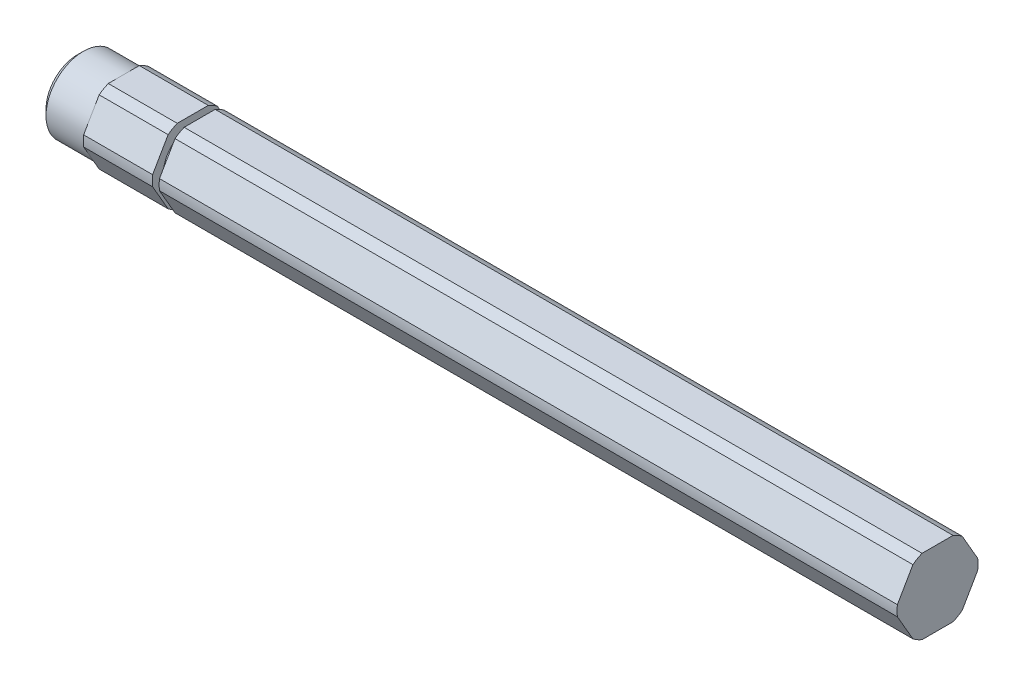
ISO-10303-21;
HEADER;
FILE_DESCRIPTION(('STEP AP214'),'2;1');
FILE_NAME('part.step','',(''),(''),'','','');
FILE_SCHEMA(('AUTOMOTIVE_DESIGN { 1 0 10303 214 1 1 1 1 }'));
ENDSEC;
DATA;
#1=APPLICATION_CONTEXT('core data for automotive mechanical design processes');
#2=APPLICATION_PROTOCOL_DEFINITION('international standard','automotive_design',2000,#1);
#3=PRODUCT_CONTEXT('',#1,'mechanical');
#4=PRODUCT('Part','Part','',(#3));
#5=PRODUCT_RELATED_PRODUCT_CATEGORY('part','',(#4));
#6=PRODUCT_DEFINITION_FORMATION('','',#4);
#7=PRODUCT_DEFINITION_CONTEXT('part definition',#1,'design');
#8=PRODUCT_DEFINITION('design','',#6,#7);
#9=PRODUCT_DEFINITION_SHAPE('','',#8);
#10=(LENGTH_UNIT() NAMED_UNIT(*) SI_UNIT(.MILLI.,.METRE.));
#11=(NAMED_UNIT(*) PLANE_ANGLE_UNIT() SI_UNIT($,.RADIAN.));
#12=(NAMED_UNIT(*) SI_UNIT($,.STERADIAN.) SOLID_ANGLE_UNIT());
#13=UNCERTAINTY_MEASURE_WITH_UNIT(LENGTH_MEASURE(1.E-05),#10,'distance_accuracy_value','');
#14=(GEOMETRIC_REPRESENTATION_CONTEXT(3) GLOBAL_UNCERTAINTY_ASSIGNED_CONTEXT((#13)) GLOBAL_UNIT_ASSIGNED_CONTEXT((#10,
#11,#12)) REPRESENTATION_CONTEXT('',''));
#15=CARTESIAN_POINT('',(0.,0.,0.));
#16=DIRECTION('',(0.,0.,1.));
#17=DIRECTION('',(1.,0.,0.));
#18=AXIS2_PLACEMENT_3D('',#15,#16,#17);
#19=CARTESIAN_POINT('',(73.025,0.,0.));
#20=DIRECTION('',(-1.,0.,0.));
#21=DIRECTION('',(0.,0.,1.));
#22=AXIS2_PLACEMENT_3D('',#19,#20,#21);
#23=CYLINDRICAL_SURFACE('',#22,6.875);
#24=DIRECTION('',(-1.,0.,0.));
#25=VECTOR('',#24,1.);
#26=CARTESIAN_POINT('',(73.025,6.35,-2.63498102459961));
#27=LINE('',#26,#25);
#28=CARTESIAN_POINT('',(-53.4289,6.35,-2.63498102459961));
#29=VERTEX_POINT('',#28);
#30=CARTESIAN_POINT('',(-65.1383,6.35,-2.63498102459961));
#31=VERTEX_POINT('',#30);
#32=EDGE_CURVE('E251',#29,#31,#27,.T.);
#33=ORIENTED_EDGE('',*,*,#32,.F.);
#34=CARTESIAN_POINT('',(-53.4289,0.,0.));
#35=DIRECTION('',(-1.,0.,0.));
#36=DIRECTION('',(0.,0.,1.));
#37=AXIS2_PLACEMENT_3D('',#34,#35,#36);
#38=CIRCLE('',#37,6.875);
#39=CARTESIAN_POINT('',(-53.4289,5.45696050579321,-4.18177080173138));
#40=VERTEX_POINT('',#39);
#41=EDGE_CURVE('E387',#29,#40,#38,.T.);
#42=ORIENTED_EDGE('',*,*,#41,.T.);
#43=DIRECTION('',(-1.,0.,0.));
#44=VECTOR('',#43,1.);
#45=CARTESIAN_POINT('',(73.025,5.45696050579321,-4.18177080173138));
#46=LINE('',#45,#44);
#47=CARTESIAN_POINT('',(-65.1383,5.45696050579321,-4.18177080173138));
#48=VERTEX_POINT('',#47);
#49=EDGE_CURVE('E295',#40,#48,#46,.T.);
#50=ORIENTED_EDGE('',*,*,#49,.T.);
#51=CARTESIAN_POINT('',(-65.1383,0.,0.));
#52=DIRECTION('',(-1.,0.,0.));
#53=DIRECTION('',(0.,0.,1.));
#54=AXIS2_PLACEMENT_3D('',#51,#52,#53);
#55=CIRCLE('',#54,6.875);
#56=EDGE_CURVE('E352',#31,#48,#55,.T.);
#57=ORIENTED_EDGE('',*,*,#56,.F.);
#58=EDGE_LOOP('',(#33,#42,#50,#57));
#59=FACE_BOUND('',#58,.T.);
#60=ADVANCED_FACE('F40',(#59),#23,.T.);
#61=CARTESIAN_POINT('',(73.025,6.35,-2.63498102459961));
#62=DIRECTION('',(0.,-1.,0.));
#63=DIRECTION('',(0.,0.,-1.));
#64=AXIS2_PLACEMENT_3D('',#61,#62,#63);
#65=PLANE('',#64);
#66=DIRECTION('',(-1.,0.,0.));
#67=VECTOR('',#66,1.);
#68=CARTESIAN_POINT('',(73.025,6.35,2.63498102459961));
#69=LINE('',#68,#67);
#70=CARTESIAN_POINT('',(-53.4289,6.35,2.63498102459961));
#71=VERTEX_POINT('',#70);
#72=CARTESIAN_POINT('',(-65.1383,6.35,2.63498102459961));
#73=VERTEX_POINT('',#72);
#74=EDGE_CURVE('E257',#71,#73,#69,.T.);
#75=ORIENTED_EDGE('',*,*,#74,.F.);
#76=DIRECTION('',(0.,0.,-1.));
#77=VECTOR('',#76,1.);
#78=CARTESIAN_POINT('',(-53.4289,6.35,2.63498102459961));
#79=LINE('',#78,#77);
#80=EDGE_CURVE('E243',#71,#29,#79,.T.);
#81=ORIENTED_EDGE('',*,*,#80,.T.);
#82=ORIENTED_EDGE('',*,*,#32,.T.);
#83=DIRECTION('',(0.,0.,-1.));
#84=VECTOR('',#83,1.);
#85=CARTESIAN_POINT('',(-65.1383,6.35,2.63498102459961));
#86=LINE('',#85,#84);
#87=EDGE_CURVE('E319',#73,#31,#86,.T.);
#88=ORIENTED_EDGE('',*,*,#87,.F.);
#89=EDGE_LOOP('',(#75,#81,#82,#88));
#90=FACE_BOUND('',#89,.T.);
#91=ADVANCED_FACE('F218',(#90),#65,.F.);
#92=CARTESIAN_POINT('',(73.025,0.,0.));
#93=DIRECTION('',(-1.,0.,0.));
#94=DIRECTION('',(0.,0.,1.));
#95=AXIS2_PLACEMENT_3D('',#92,#93,#94);
#96=CYLINDRICAL_SURFACE('',#95,6.875);
#97=DIRECTION('',(-1.,0.,0.));
#98=VECTOR('',#97,1.);
#99=CARTESIAN_POINT('',(73.025,5.45696050579321,4.18177080173138));
#100=LINE('',#99,#98);
#101=CARTESIAN_POINT('',(-53.4289,5.45696050579321,4.18177080173138));
#102=VERTEX_POINT('',#101);
#103=CARTESIAN_POINT('',(-65.1383,5.45696050579321,4.18177080173138));
#104=VERTEX_POINT('',#103);
#105=EDGE_CURVE('E261',#102,#104,#100,.T.);
#106=ORIENTED_EDGE('',*,*,#105,.F.);
#107=CARTESIAN_POINT('',(-53.4289,0.,0.));
#108=DIRECTION('',(-1.,0.,0.));
#109=DIRECTION('',(0.,0.,1.));
#110=AXIS2_PLACEMENT_3D('',#107,#108,#109);
#111=CIRCLE('',#110,6.875);
#112=EDGE_CURVE('E360',#102,#71,#111,.T.);
#113=ORIENTED_EDGE('',*,*,#112,.T.);
#114=ORIENTED_EDGE('',*,*,#74,.T.);
#115=CARTESIAN_POINT('',(-65.1383,0.,0.));
#116=DIRECTION('',(-1.,0.,0.));
#117=DIRECTION('',(0.,0.,1.));
#118=AXIS2_PLACEMENT_3D('',#115,#116,#117);
#119=CIRCLE('',#118,6.875);
#120=EDGE_CURVE('E322',#104,#73,#119,.T.);
#121=ORIENTED_EDGE('',*,*,#120,.F.);
#122=EDGE_LOOP('',(#106,#113,#114,#121));
#123=FACE_BOUND('',#122,.T.);
#124=ADVANCED_FACE('F223',(#123),#96,.T.);
#125=CARTESIAN_POINT('',(73.025,5.45696050579321,4.18177080173138));
#126=DIRECTION('',(0.,-0.499999999999999,-0.866025403784439));
#127=DIRECTION('',(0.,0.866025403784439,-0.499999999999999));
#128=AXIS2_PLACEMENT_3D('',#125,#126,#127);
#129=PLANE('',#128);
#130=DIRECTION('',(-1.,0.,0.));
#131=VECTOR('',#130,1.);
#132=CARTESIAN_POINT('',(73.025,0.893039494206784,6.81675182633099));
#133=LINE('',#132,#131);
#134=CARTESIAN_POINT('',(-53.4289,0.893039494206786,6.81675182633099));
#135=VERTEX_POINT('',#134);
#136=CARTESIAN_POINT('',(-65.1383,0.893039494206786,6.81675182633099));
#137=VERTEX_POINT('',#136);
#138=EDGE_CURVE('E265',#135,#137,#133,.T.);
#139=ORIENTED_EDGE('',*,*,#138,.F.);
#140=DIRECTION('',(0.,0.866025403784439,-0.5));
#141=VECTOR('',#140,1.);
#142=CARTESIAN_POINT('',(-53.4289,0.893039494206786,6.81675182633099));
#143=LINE('',#142,#141);
#144=EDGE_CURVE('E363',#135,#102,#143,.T.);
#145=ORIENTED_EDGE('',*,*,#144,.T.);
#146=ORIENTED_EDGE('',*,*,#105,.T.);
#147=DIRECTION('',(0.,0.866025403784439,-0.5));
#148=VECTOR('',#147,1.);
#149=CARTESIAN_POINT('',(-65.1383,0.893039494206786,6.81675182633099));
#150=LINE('',#149,#148);
#151=EDGE_CURVE('E325',#137,#104,#150,.T.);
#152=ORIENTED_EDGE('',*,*,#151,.F.);
#153=EDGE_LOOP('',(#139,#145,#146,#152));
#154=FACE_BOUND('',#153,.T.);
#155=ADVANCED_FACE('F483',(#154),#129,.F.);
#156=CARTESIAN_POINT('',(73.025,0.,0.));
#157=DIRECTION('',(-1.,0.,0.));
#158=DIRECTION('',(0.,0.,1.));
#159=AXIS2_PLACEMENT_3D('',#156,#157,#158);
#160=CYLINDRICAL_SURFACE('',#159,6.875);
#161=DIRECTION('',(-1.,0.,0.));
#162=VECTOR('',#161,1.);
#163=CARTESIAN_POINT('',(73.025,-0.893039494206794,6.81675182633099));
#164=LINE('',#163,#162);
#165=CARTESIAN_POINT('',(-53.4289,-0.893039494206794,6.81675182633099));
#166=VERTEX_POINT('',#165);
#167=CARTESIAN_POINT('',(-65.1383,-0.893039494206794,6.81675182633099));
#168=VERTEX_POINT('',#167);
#169=EDGE_CURVE('E269',#166,#168,#164,.T.);
#170=ORIENTED_EDGE('',*,*,#169,.F.);
#171=CARTESIAN_POINT('',(-53.4289,0.,0.));
#172=DIRECTION('',(-1.,0.,0.));
#173=DIRECTION('',(0.,0.,1.));
#174=AXIS2_PLACEMENT_3D('',#171,#172,#173);
#175=CIRCLE('',#174,6.875);
#176=EDGE_CURVE('E366',#166,#135,#175,.T.);
#177=ORIENTED_EDGE('',*,*,#176,.T.);
#178=ORIENTED_EDGE('',*,*,#138,.T.);
#179=CARTESIAN_POINT('',(-65.1383,0.,0.));
#180=DIRECTION('',(-1.,0.,0.));
#181=DIRECTION('',(0.,0.,1.));
#182=AXIS2_PLACEMENT_3D('',#179,#180,#181);
#183=CIRCLE('',#182,6.875);
#184=EDGE_CURVE('E328',#168,#137,#183,.T.);
#185=ORIENTED_EDGE('',*,*,#184,.F.);
#186=EDGE_LOOP('',(#170,#177,#178,#185));
#187=FACE_BOUND('',#186,.T.);
#188=ADVANCED_FACE('F478',(#187),#160,.T.);
#189=CARTESIAN_POINT('',(73.025,-0.893039494206794,6.81675182633099));
#190=DIRECTION('',(0.,0.500000000000001,-0.866025403784438));
#191=DIRECTION('',(0.,0.866025403784438,0.500000000000001));
#192=AXIS2_PLACEMENT_3D('',#189,#190,#191);
#193=PLANE('',#192);
#194=DIRECTION('',(-1.,0.,0.));
#195=VECTOR('',#194,1.);
#196=CARTESIAN_POINT('',(73.025,-5.45696050579321,4.18177080173138));
#197=LINE('',#196,#195);
#198=CARTESIAN_POINT('',(-53.4289,-5.45696050579321,4.18177080173138));
#199=VERTEX_POINT('',#198);
#200=CARTESIAN_POINT('',(-65.1383,-5.45696050579321,4.18177080173138));
#201=VERTEX_POINT('',#200);
#202=EDGE_CURVE('E273',#199,#201,#197,.T.);
#203=ORIENTED_EDGE('',*,*,#202,.F.);
#204=DIRECTION('',(0.,0.866025403784438,0.5));
#205=VECTOR('',#204,1.);
#206=CARTESIAN_POINT('',(-53.4289,-5.45696050579321,4.18177080173138));
#207=LINE('',#206,#205);
#208=EDGE_CURVE('E369',#199,#166,#207,.T.);
#209=ORIENTED_EDGE('',*,*,#208,.T.);
#210=ORIENTED_EDGE('',*,*,#169,.T.);
#211=DIRECTION('',(0.,0.866025403784438,0.500000000000001));
#212=VECTOR('',#211,1.);
#213=CARTESIAN_POINT('',(-65.1383,-5.45696050579321,4.18177080173138));
#214=LINE('',#213,#212);
#215=EDGE_CURVE('E331',#201,#168,#214,.T.);
#216=ORIENTED_EDGE('',*,*,#215,.F.);
#217=EDGE_LOOP('',(#203,#209,#210,#216));
#218=FACE_BOUND('',#217,.T.);
#219=ADVANCED_FACE('F473',(#218),#193,.F.);
#220=CARTESIAN_POINT('',(73.025,0.,0.));
#221=DIRECTION('',(-1.,0.,0.));
#222=DIRECTION('',(0.,0.,1.));
#223=AXIS2_PLACEMENT_3D('',#220,#221,#222);
#224=CYLINDRICAL_SURFACE('',#223,6.875);
#225=DIRECTION('',(-1.,0.,0.));
#226=VECTOR('',#225,1.);
#227=CARTESIAN_POINT('',(73.025,-6.35,2.6349810245996));
#228=LINE('',#227,#226);
#229=CARTESIAN_POINT('',(-53.4289,-6.35,2.6349810245996));
#230=VERTEX_POINT('',#229);
#231=CARTESIAN_POINT('',(-65.1383,-6.35,2.6349810245996));
#232=VERTEX_POINT('',#231);
#233=EDGE_CURVE('E277',#230,#232,#228,.T.);
#234=ORIENTED_EDGE('',*,*,#233,.F.);
#235=CARTESIAN_POINT('',(-53.4289,0.,0.));
#236=DIRECTION('',(-1.,0.,0.));
#237=DIRECTION('',(0.,0.,1.));
#238=AXIS2_PLACEMENT_3D('',#235,#236,#237);
#239=CIRCLE('',#238,6.875);
#240=EDGE_CURVE('E372',#230,#199,#239,.T.);
#241=ORIENTED_EDGE('',*,*,#240,.T.);
#242=ORIENTED_EDGE('',*,*,#202,.T.);
#243=CARTESIAN_POINT('',(-65.1383,0.,0.));
#244=DIRECTION('',(-1.,0.,0.));
#245=DIRECTION('',(0.,0.,1.));
#246=AXIS2_PLACEMENT_3D('',#243,#244,#245);
#247=CIRCLE('',#246,6.875);
#248=EDGE_CURVE('E334',#232,#201,#247,.T.);
#249=ORIENTED_EDGE('',*,*,#248,.F.);
#250=EDGE_LOOP('',(#234,#241,#242,#249));
#251=FACE_BOUND('',#250,.T.);
#252=ADVANCED_FACE('F468',(#251),#224,.T.);
#253=CARTESIAN_POINT('',(73.025,-6.35,2.6349810245996));
#254=DIRECTION('',(0.,1.,0.));
#255=DIRECTION('',(0.,0.,1.));
#256=AXIS2_PLACEMENT_3D('',#253,#254,#255);
#257=PLANE('',#256);
#258=DIRECTION('',(-1.,0.,0.));
#259=VECTOR('',#258,1.);
#260=CARTESIAN_POINT('',(73.025,-6.35,-2.6349810245996));
#261=LINE('',#260,#259);
#262=CARTESIAN_POINT('',(-53.4289,-6.35,-2.6349810245996));
#263=VERTEX_POINT('',#262);
#264=CARTESIAN_POINT('',(-65.1383,-6.35,-2.6349810245996));
#265=VERTEX_POINT('',#264);
#266=EDGE_CURVE('E281',#263,#265,#261,.T.);
#267=ORIENTED_EDGE('',*,*,#266,.F.);
#268=DIRECTION('',(0.,0.,1.));
#269=VECTOR('',#268,1.);
#270=CARTESIAN_POINT('',(-53.4289,-6.35,-2.6349810245996));
#271=LINE('',#270,#269);
#272=EDGE_CURVE('E375',#263,#230,#271,.T.);
#273=ORIENTED_EDGE('',*,*,#272,.T.);
#274=ORIENTED_EDGE('',*,*,#233,.T.);
#275=DIRECTION('',(0.,0.,1.));
#276=VECTOR('',#275,1.);
#277=CARTESIAN_POINT('',(-65.1383,-6.35,-2.6349810245996));
#278=LINE('',#277,#276);
#279=EDGE_CURVE('E337',#265,#232,#278,.T.);
#280=ORIENTED_EDGE('',*,*,#279,.F.);
#281=EDGE_LOOP('',(#267,#273,#274,#280));
#282=FACE_BOUND('',#281,.T.);
#283=ADVANCED_FACE('F463',(#282),#257,.F.);
#284=CARTESIAN_POINT('',(73.025,0.,0.));
#285=DIRECTION('',(-1.,0.,0.));
#286=DIRECTION('',(0.,0.,1.));
#287=AXIS2_PLACEMENT_3D('',#284,#285,#286);
#288=CYLINDRICAL_SURFACE('',#287,6.875);
#289=DIRECTION('',(-1.,0.,0.));
#290=VECTOR('',#289,1.);
#291=CARTESIAN_POINT('',(73.025,-5.45696050579321,-4.18177080173138));
#292=LINE('',#291,#290);
#293=CARTESIAN_POINT('',(-53.4289,-5.45696050579321,-4.18177080173138));
#294=VERTEX_POINT('',#293);
#295=CARTESIAN_POINT('',(-65.1383,-5.45696050579321,-4.18177080173138));
#296=VERTEX_POINT('',#295);
#297=EDGE_CURVE('E285',#294,#296,#292,.T.);
#298=ORIENTED_EDGE('',*,*,#297,.F.);
#299=CARTESIAN_POINT('',(-53.4289,0.,0.));
#300=DIRECTION('',(-1.,0.,0.));
#301=DIRECTION('',(0.,0.,1.));
#302=AXIS2_PLACEMENT_3D('',#299,#300,#301);
#303=CIRCLE('',#302,6.875);
#304=EDGE_CURVE('E378',#294,#263,#303,.T.);
#305=ORIENTED_EDGE('',*,*,#304,.T.);
#306=ORIENTED_EDGE('',*,*,#266,.T.);
#307=CARTESIAN_POINT('',(-65.1383,0.,0.));
#308=DIRECTION('',(-1.,0.,0.));
#309=DIRECTION('',(0.,0.,1.));
#310=AXIS2_PLACEMENT_3D('',#307,#308,#309);
#311=CIRCLE('',#310,6.875);
#312=EDGE_CURVE('E340',#296,#265,#311,.T.);
#313=ORIENTED_EDGE('',*,*,#312,.F.);
#314=EDGE_LOOP('',(#298,#305,#306,#313));
#315=FACE_BOUND('',#314,.T.);
#316=ADVANCED_FACE('F458',(#315),#288,.T.);
#317=CARTESIAN_POINT('',(73.025,-5.45696050579321,-4.18177080173138));
#318=DIRECTION('',(0.,0.5,0.866025403784439));
#319=DIRECTION('',(0.,-0.866025403784439,0.5));
#320=AXIS2_PLACEMENT_3D('',#317,#318,#319);
#321=PLANE('',#320);
#322=DIRECTION('',(-1.,0.,0.));
#323=VECTOR('',#322,1.);
#324=CARTESIAN_POINT('',(73.025,-0.893039494206787,-6.81675182633099));
#325=LINE('',#324,#323);
#326=CARTESIAN_POINT('',(-53.4289,-0.893039494206782,-6.81675182633099));
#327=VERTEX_POINT('',#326);
#328=CARTESIAN_POINT('',(-65.1383,-0.893039494206785,-6.81675182633099));
#329=VERTEX_POINT('',#328);
#330=EDGE_CURVE('E289',#327,#329,#325,.T.);
#331=ORIENTED_EDGE('',*,*,#330,.F.);
#332=DIRECTION('',(0.,-0.866025403784439,0.499999999999999));
#333=VECTOR('',#332,1.);
#334=CARTESIAN_POINT('',(-53.4289,-0.893039494206782,-6.81675182633099));
#335=LINE('',#334,#333);
#336=EDGE_CURVE('E381',#327,#294,#335,.T.);
#337=ORIENTED_EDGE('',*,*,#336,.T.);
#338=ORIENTED_EDGE('',*,*,#297,.T.);
#339=DIRECTION('',(0.,-0.866025403784439,0.499999999999999));
#340=VECTOR('',#339,1.);
#341=CARTESIAN_POINT('',(-65.1383,-0.893039494206785,-6.81675182633099));
#342=LINE('',#341,#340);
#343=EDGE_CURVE('E343',#329,#296,#342,.T.);
#344=ORIENTED_EDGE('',*,*,#343,.F.);
#345=EDGE_LOOP('',(#331,#337,#338,#344));
#346=FACE_BOUND('',#345,.T.);
#347=ADVANCED_FACE('F453',(#346),#321,.F.);
#348=CARTESIAN_POINT('',(73.025,0.,0.));
#349=DIRECTION('',(-1.,0.,0.));
#350=DIRECTION('',(0.,0.,1.));
#351=AXIS2_PLACEMENT_3D('',#348,#349,#350);
#352=CYLINDRICAL_SURFACE('',#351,6.875);
#353=DIRECTION('',(-1.,0.,0.));
#354=VECTOR('',#353,1.);
#355=CARTESIAN_POINT('',(73.025,0.893039494206796,-6.81675182633099));
#356=LINE('',#355,#354);
#357=CARTESIAN_POINT('',(-53.4289,0.893039494206796,-6.81675182633099));
#358=VERTEX_POINT('',#357);
#359=CARTESIAN_POINT('',(-65.1383,0.893039494206796,-6.81675182633099));
#360=VERTEX_POINT('',#359);
#361=EDGE_CURVE('E293',#358,#360,#356,.T.);
#362=ORIENTED_EDGE('',*,*,#361,.F.);
#363=CARTESIAN_POINT('',(-53.4289,0.,0.));
#364=DIRECTION('',(-1.,0.,0.));
#365=DIRECTION('',(0.,0.,1.));
#366=AXIS2_PLACEMENT_3D('',#363,#364,#365);
#367=CIRCLE('',#366,6.875);
#368=EDGE_CURVE('E56',#358,#327,#367,.T.);
#369=ORIENTED_EDGE('',*,*,#368,.T.);
#370=ORIENTED_EDGE('',*,*,#330,.T.);
#371=CARTESIAN_POINT('',(-65.1383,0.,0.));
#372=DIRECTION('',(-1.,0.,0.));
#373=DIRECTION('',(0.,0.,1.));
#374=AXIS2_PLACEMENT_3D('',#371,#372,#373);
#375=CIRCLE('',#374,6.875);
#376=EDGE_CURVE('E346',#360,#329,#375,.T.);
#377=ORIENTED_EDGE('',*,*,#376,.F.);
#378=EDGE_LOOP('',(#362,#369,#370,#377));
#379=FACE_BOUND('',#378,.T.);
#380=ADVANCED_FACE('F448',(#379),#352,.T.);
#381=CARTESIAN_POINT('',(73.025,0.893039494206796,-6.81675182633099));
#382=DIRECTION('',(0.,-0.500000000000001,0.866025403784438));
#383=DIRECTION('',(0.,-0.866025403784438,-0.500000000000001));
#384=AXIS2_PLACEMENT_3D('',#381,#382,#383);
#385=PLANE('',#384);
#386=ORIENTED_EDGE('',*,*,#49,.F.);
#387=DIRECTION('',(0.,-0.866025403784438,-0.500000000000001));
#388=VECTOR('',#387,1.);
#389=CARTESIAN_POINT('',(-53.4289,5.45696050579321,-4.18177080173138));
#390=LINE('',#389,#388);
#391=EDGE_CURVE('E385',#40,#358,#390,.T.);
#392=ORIENTED_EDGE('',*,*,#391,.T.);
#393=ORIENTED_EDGE('',*,*,#361,.T.);
#394=DIRECTION('',(0.,-0.866025403784438,-0.500000000000001));
#395=VECTOR('',#394,1.);
#396=CARTESIAN_POINT('',(-65.1383,5.45696050579321,-4.18177080173138));
#397=LINE('',#396,#395);
#398=EDGE_CURVE('E349',#48,#360,#397,.T.);
#399=ORIENTED_EDGE('',*,*,#398,.F.);
#400=EDGE_LOOP('',(#386,#392,#393,#399));
#401=FACE_BOUND('',#400,.T.);
#402=ADVANCED_FACE('F445',(#401),#385,.F.);
#403=CARTESIAN_POINT('',(-65.1383,0.,0.));
#404=DIRECTION('',(-1.,0.,0.));
#405=DIRECTION('',(0.,0.,1.));
#406=AXIS2_PLACEMENT_3D('',#403,#404,#405);
#407=PLANE('',#406);
#408=CARTESIAN_POINT('',(-65.1383,0.,0.));
#409=DIRECTION('',(-1.,0.,0.));
#410=DIRECTION('',(0.,0.,1.));
#411=AXIS2_PLACEMENT_3D('',#408,#409,#410);
#412=CIRCLE('',#411,6.3373);
#413=CARTESIAN_POINT('',(-65.1383,0.,6.3373));
#414=VERTEX_POINT('',#413);
#415=EDGE_CURVE('E355',#414,#414,#412,.T.);
#416=ORIENTED_EDGE('',*,*,#415,.F.);
#417=EDGE_LOOP('',(#416));
#418=FACE_BOUND('',#417,.T.);
#419=ORIENTED_EDGE('',*,*,#56,.T.);
#420=ORIENTED_EDGE('',*,*,#398,.T.);
#421=ORIENTED_EDGE('',*,*,#376,.T.);
#422=ORIENTED_EDGE('',*,*,#343,.T.);
#423=ORIENTED_EDGE('',*,*,#312,.T.);
#424=ORIENTED_EDGE('',*,*,#279,.T.);
#425=ORIENTED_EDGE('',*,*,#248,.T.);
#426=ORIENTED_EDGE('',*,*,#215,.T.);
#427=ORIENTED_EDGE('',*,*,#184,.T.);
#428=ORIENTED_EDGE('',*,*,#151,.T.);
#429=ORIENTED_EDGE('',*,*,#120,.T.);
#430=ORIENTED_EDGE('',*,*,#87,.T.);
#431=EDGE_LOOP('',(#419,#420,#421,#422,#423,#424,#425,#426,#427,#428,#429,#430));
#432=FACE_BOUND('',#431,.T.);
#433=ADVANCED_FACE('F438',(#418,#432),#407,.T.);
#434=CARTESIAN_POINT('',(-65.1383,0.,0.));
#435=DIRECTION('',(-1.,0.,0.));
#436=DIRECTION('',(0.,0.,1.));
#437=AXIS2_PLACEMENT_3D('',#434,#435,#436);
#438=CYLINDRICAL_SURFACE('',#437,6.3373);
#439=CARTESIAN_POINT('',(-72.009,0.,0.));
#440=DIRECTION('',(1.,0.,0.));
#441=DIRECTION('',(0.,0.,-1.));
#442=AXIS2_PLACEMENT_3D('',#439,#440,#441);
#443=CIRCLE('',#442,6.3373);
#444=CARTESIAN_POINT('',(-72.009,0.,-6.3373));
#445=VERTEX_POINT('',#444);
#446=EDGE_CURVE('E11',#445,#445,#443,.T.);
#447=ORIENTED_EDGE('',*,*,#446,.T.);
#448=EDGE_LOOP('',(#447));
#449=FACE_BOUND('',#448,.T.);
#450=ORIENTED_EDGE('',*,*,#415,.T.);
#451=EDGE_LOOP('',(#450));
#452=FACE_BOUND('',#451,.T.);
#453=ADVANCED_FACE('F427',(#449,#452),#438,.T.);
#454=CARTESIAN_POINT('',(-73.025,0.,0.));
#455=DIRECTION('',(1.,0.,0.));
#456=DIRECTION('',(0.,0.,-1.));
#457=AXIS2_PLACEMENT_3D('',#454,#455,#456);
#458=PLANE('',#457);
#459=CARTESIAN_POINT('',(-73.025,0.,0.));
#460=DIRECTION('',(1.,0.,0.));
#461=DIRECTION('',(0.,0.,-1.));
#462=AXIS2_PLACEMENT_3D('',#459,#460,#461);
#463=CIRCLE('',#462,5.32130000000002);
#464=CARTESIAN_POINT('',(-73.025,0.,-5.32130000000002));
#465=VERTEX_POINT('',#464);
#466=EDGE_CURVE('E49',#465,#465,#463,.F.);
#467=ORIENTED_EDGE('',*,*,#466,.T.);
#468=EDGE_LOOP('',(#467));
#469=FACE_BOUND('',#468,.T.);
#470=CARTESIAN_POINT('',(-73.025,0.,0.));
#471=DIRECTION('',(-1.,0.,0.));
#472=DIRECTION('',(0.,0.,1.));
#473=AXIS2_PLACEMENT_3D('',#470,#471,#472);
#474=CIRCLE('',#473,3.175);
#475=CARTESIAN_POINT('',(-73.025,0.,3.175));
#476=VERTEX_POINT('',#475);
#477=EDGE_CURVE('E414',#476,#476,#474,.T.);
#478=ORIENTED_EDGE('',*,*,#477,.F.);
#479=EDGE_LOOP('',(#478));
#480=FACE_BOUND('',#479,.T.);
#481=ADVANCED_FACE('F424',(#469,#480),#458,.F.);
#482=CARTESIAN_POINT('',(-52.2605,0.,0.));
#483=DIRECTION('',(-1.,0.,0.));
#484=DIRECTION('',(0.,0.,1.));
#485=AXIS2_PLACEMENT_3D('',#482,#483,#484);
#486=PLANE('',#485);
#487=CARTESIAN_POINT('',(-52.2605,0.,0.));
#488=DIRECTION('',(-1.,0.,0.));
#489=DIRECTION('',(0.,0.,1.));
#490=AXIS2_PLACEMENT_3D('',#487,#488,#489);
#491=CIRCLE('',#490,5.0292);
#492=CARTESIAN_POINT('',(-52.2605,0.,5.0292));
#493=VERTEX_POINT('',#492);
#494=EDGE_CURVE('E390',#493,#493,#491,.T.);
#495=ORIENTED_EDGE('',*,*,#494,.F.);
#496=EDGE_LOOP('',(#495));
#497=FACE_BOUND('',#496,.T.);
#498=CARTESIAN_POINT('',(-52.2605,0.,0.));
#499=DIRECTION('',(-1.,0.,0.));
#500=DIRECTION('',(0.,0.,1.));
#501=AXIS2_PLACEMENT_3D('',#498,#499,#500);
#502=CIRCLE('',#501,6.875);
#503=CARTESIAN_POINT('',(-52.2605,6.35,-2.63498102459961));
#504=VERTEX_POINT('',#503);
#505=CARTESIAN_POINT('',(-52.2605,5.45696050579321,-4.18177080173138));
#506=VERTEX_POINT('',#505);
#507=EDGE_CURVE('E64',#504,#506,#502,.T.);
#508=ORIENTED_EDGE('',*,*,#507,.T.);
#509=DIRECTION('',(0.,-0.866025403784438,-0.500000000000001));
#510=VECTOR('',#509,1.);
#511=CARTESIAN_POINT('',(-52.2605,5.45696050579321,-4.18177080173138));
#512=LINE('',#511,#510);
#513=CARTESIAN_POINT('',(-52.2605,0.893039494206796,-6.81675182633099));
#514=VERTEX_POINT('',#513);
#515=EDGE_CURVE('E242',#506,#514,#512,.T.);
#516=ORIENTED_EDGE('',*,*,#515,.T.);
#517=CARTESIAN_POINT('',(-52.2605,0.,0.));
#518=DIRECTION('',(-1.,0.,0.));
#519=DIRECTION('',(0.,0.,1.));
#520=AXIS2_PLACEMENT_3D('',#517,#518,#519);
#521=CIRCLE('',#520,6.875);
#522=CARTESIAN_POINT('',(-52.2605,-0.893039494206782,-6.81675182633099));
#523=VERTEX_POINT('',#522);
#524=EDGE_CURVE('E408',#514,#523,#521,.T.);
#525=ORIENTED_EDGE('',*,*,#524,.T.);
#526=DIRECTION('',(0.,-0.866025403784439,0.499999999999999));
#527=VECTOR('',#526,1.);
#528=CARTESIAN_POINT('',(-52.2605,-0.893039494206782,-6.81675182633099));
#529=LINE('',#528,#527);
#530=CARTESIAN_POINT('',(-52.2605,-5.45696050579321,-4.18177080173138));
#531=VERTEX_POINT('',#530);
#532=EDGE_CURVE('E406',#523,#531,#529,.T.);
#533=ORIENTED_EDGE('',*,*,#532,.T.);
#534=CARTESIAN_POINT('',(-52.2605,0.,0.));
#535=DIRECTION('',(-1.,0.,0.));
#536=DIRECTION('',(0.,0.,1.));
#537=AXIS2_PLACEMENT_3D('',#534,#535,#536);
#538=CIRCLE('',#537,6.875);
#539=CARTESIAN_POINT('',(-52.2605,-6.35,-2.6349810245996));
#540=VERTEX_POINT('',#539);
#541=EDGE_CURVE('E404',#531,#540,#538,.T.);
#542=ORIENTED_EDGE('',*,*,#541,.T.);
#543=DIRECTION('',(0.,0.,1.));
#544=VECTOR('',#543,1.);
#545=CARTESIAN_POINT('',(-52.2605,-6.35,-2.6349810245996));
#546=LINE('',#545,#544);
#547=CARTESIAN_POINT('',(-52.2605,-6.35,2.6349810245996));
#548=VERTEX_POINT('',#547);
#549=EDGE_CURVE('E402',#540,#548,#546,.T.);
#550=ORIENTED_EDGE('',*,*,#549,.T.);
#551=CARTESIAN_POINT('',(-52.2605,0.,0.));
#552=DIRECTION('',(-1.,0.,0.));
#553=DIRECTION('',(0.,0.,1.));
#554=AXIS2_PLACEMENT_3D('',#551,#552,#553);
#555=CIRCLE('',#554,6.875);
#556=CARTESIAN_POINT('',(-52.2605,-5.45696050579321,4.18177080173138));
#557=VERTEX_POINT('',#556);
#558=EDGE_CURVE('E400',#548,#557,#555,.T.);
#559=ORIENTED_EDGE('',*,*,#558,.T.);
#560=DIRECTION('',(0.,0.866025403784438,0.5));
#561=VECTOR('',#560,1.);
#562=CARTESIAN_POINT('',(-52.2605,-5.45696050579321,4.18177080173138));
#563=LINE('',#562,#561);
#564=CARTESIAN_POINT('',(-52.2605,-0.893039494206794,6.81675182633099));
#565=VERTEX_POINT('',#564);
#566=EDGE_CURVE('E398',#557,#565,#563,.T.);
#567=ORIENTED_EDGE('',*,*,#566,.T.);
#568=CARTESIAN_POINT('',(-52.2605,0.,0.));
#569=DIRECTION('',(-1.,0.,0.));
#570=DIRECTION('',(0.,0.,1.));
#571=AXIS2_PLACEMENT_3D('',#568,#569,#570);
#572=CIRCLE('',#571,6.875);
#573=CARTESIAN_POINT('',(-52.2605,0.893039494206786,6.81675182633099));
#574=VERTEX_POINT('',#573);
#575=EDGE_CURVE('E396',#565,#574,#572,.T.);
#576=ORIENTED_EDGE('',*,*,#575,.T.);
#577=DIRECTION('',(0.,0.866025403784439,-0.5));
#578=VECTOR('',#577,1.);
#579=CARTESIAN_POINT('',(-52.2605,0.893039494206786,6.81675182633099));
#580=LINE('',#579,#578);
#581=CARTESIAN_POINT('',(-52.2605,5.45696050579321,4.18177080173138));
#582=VERTEX_POINT('',#581);
#583=EDGE_CURVE('E394',#574,#582,#580,.T.);
#584=ORIENTED_EDGE('',*,*,#583,.T.);
#585=CARTESIAN_POINT('',(-52.2605,0.,0.));
#586=DIRECTION('',(-1.,0.,0.));
#587=DIRECTION('',(0.,0.,1.));
#588=AXIS2_PLACEMENT_3D('',#585,#586,#587);
#589=CIRCLE('',#588,6.875);
#590=CARTESIAN_POINT('',(-52.2605,6.35,2.63498102459961));
#591=VERTEX_POINT('',#590);
#592=EDGE_CURVE('E392',#582,#591,#589,.T.);
#593=ORIENTED_EDGE('',*,*,#592,.T.);
#594=DIRECTION('',(0.,0.,-1.));
#595=VECTOR('',#594,1.);
#596=CARTESIAN_POINT('',(-52.2605,6.35,2.63498102459961));
#597=LINE('',#596,#595);
#598=EDGE_CURVE('E247',#591,#504,#597,.T.);
#599=ORIENTED_EDGE('',*,*,#598,.T.);
#600=EDGE_LOOP('',(#508,#516,#525,#533,#542,#550,#559,#567,#576,#584,#593,#599));
#601=FACE_BOUND('',#600,.T.);
#602=ADVANCED_FACE('F426',(#497,#601),#486,.T.);
#603=CARTESIAN_POINT('',(-53.4289,0.,0.));
#604=DIRECTION('',(-1.,0.,0.));
#605=DIRECTION('',(0.,0.,1.));
#606=AXIS2_PLACEMENT_3D('',#603,#604,#605);
#607=PLANE('',#606);
#608=CARTESIAN_POINT('',(-53.4289,0.,0.));
#609=DIRECTION('',(-1.,0.,0.));
#610=DIRECTION('',(0.,0.,1.));
#611=AXIS2_PLACEMENT_3D('',#608,#609,#610);
#612=CIRCLE('',#611,5.0292);
#613=CARTESIAN_POINT('',(-53.4289,0.,5.0292));
#614=VERTEX_POINT('',#613);
#615=EDGE_CURVE('E411',#614,#614,#612,.T.);
#616=ORIENTED_EDGE('',*,*,#615,.T.);
#617=EDGE_LOOP('',(#616));
#618=FACE_BOUND('',#617,.T.);
#619=ORIENTED_EDGE('',*,*,#41,.F.);
#620=ORIENTED_EDGE('',*,*,#80,.F.);
#621=ORIENTED_EDGE('',*,*,#112,.F.);
#622=ORIENTED_EDGE('',*,*,#144,.F.);
#623=ORIENTED_EDGE('',*,*,#176,.F.);
#624=ORIENTED_EDGE('',*,*,#208,.F.);
#625=ORIENTED_EDGE('',*,*,#240,.F.);
#626=ORIENTED_EDGE('',*,*,#272,.F.);
#627=ORIENTED_EDGE('',*,*,#304,.F.);
#628=ORIENTED_EDGE('',*,*,#336,.F.);
#629=ORIENTED_EDGE('',*,*,#368,.F.);
#630=ORIENTED_EDGE('',*,*,#391,.F.);
#631=EDGE_LOOP('',(#619,#620,#621,#622,#623,#624,#625,#626,#627,#628,#629,#630));
#632=FACE_BOUND('',#631,.T.);
#633=ADVANCED_FACE('F435',(#618,#632),#607,.F.);
#634=CARTESIAN_POINT('',(-52.2605,0.,0.));
#635=DIRECTION('',(-1.,0.,0.));
#636=DIRECTION('',(0.,0.,1.));
#637=AXIS2_PLACEMENT_3D('',#634,#635,#636);
#638=CYLINDRICAL_SURFACE('',#637,5.0292);
#639=ORIENTED_EDGE('',*,*,#494,.T.);
#640=EDGE_LOOP('',(#639));
#641=FACE_BOUND('',#640,.T.);
#642=ORIENTED_EDGE('',*,*,#615,.F.);
#643=EDGE_LOOP('',(#642));
#644=FACE_BOUND('',#643,.T.);
#645=ADVANCED_FACE('F563',(#641,#644),#638,.T.);
#646=CARTESIAN_POINT('',(73.025,0.,0.));
#647=DIRECTION('',(1.,0.,0.));
#648=DIRECTION('',(0.,0.,-1.));
#649=AXIS2_PLACEMENT_3D('',#646,#647,#648);
#650=PLANE('',#649);
#651=CARTESIAN_POINT('',(73.025,0.,0.));
#652=DIRECTION('',(1.,0.,0.));
#653=DIRECTION('',(0.,0.,-1.));
#654=AXIS2_PLACEMENT_3D('',#651,#652,#653);
#655=CIRCLE('',#654,6.875);
#656=CARTESIAN_POINT('',(73.025,5.45696050579321,-4.18177080173138));
#657=VERTEX_POINT('',#656);
#658=CARTESIAN_POINT('',(73.025,6.35,-2.63498102459961));
#659=VERTEX_POINT('',#658);
#660=EDGE_CURVE('E317',#657,#659,#655,.T.);
#661=ORIENTED_EDGE('',*,*,#660,.T.);
#662=DIRECTION('',(0.,0.,1.));
#663=VECTOR('',#662,1.);
#664=CARTESIAN_POINT('',(73.025,6.35,-2.63498102459961));
#665=LINE('',#664,#663);
#666=CARTESIAN_POINT('',(73.025,6.35,2.63498102459961));
#667=VERTEX_POINT('',#666);
#668=EDGE_CURVE('E249',#659,#667,#665,.T.);
#669=ORIENTED_EDGE('',*,*,#668,.T.);
#670=CARTESIAN_POINT('',(73.025,0.,0.));
#671=DIRECTION('',(1.,0.,0.));
#672=DIRECTION('',(0.,0.,-1.));
#673=AXIS2_PLACEMENT_3D('',#670,#671,#672);
#674=CIRCLE('',#673,6.875);
#675=CARTESIAN_POINT('',(73.025,5.45696050579321,4.18177080173138));
#676=VERTEX_POINT('',#675);
#677=EDGE_CURVE('E314',#667,#676,#674,.T.);
#678=ORIENTED_EDGE('',*,*,#677,.T.);
#679=DIRECTION('',(0.,-0.866025403784439,0.499999999999999));
#680=VECTOR('',#679,1.);
#681=CARTESIAN_POINT('',(73.025,5.45696050579321,4.18177080173138));
#682=LINE('',#681,#680);
#683=CARTESIAN_POINT('',(73.025,0.893039494206784,6.81675182633099));
#684=VERTEX_POINT('',#683);
#685=EDGE_CURVE('E312',#676,#684,#682,.T.);
#686=ORIENTED_EDGE('',*,*,#685,.T.);
#687=CARTESIAN_POINT('',(73.025,0.,0.));
#688=DIRECTION('',(1.,0.,0.));
#689=DIRECTION('',(0.,0.,-1.));
#690=AXIS2_PLACEMENT_3D('',#687,#688,#689);
#691=CIRCLE('',#690,6.875);
#692=CARTESIAN_POINT('',(73.025,-0.893039494206794,6.81675182633099));
#693=VERTEX_POINT('',#692);
#694=EDGE_CURVE('E310',#684,#693,#691,.T.);
#695=ORIENTED_EDGE('',*,*,#694,.T.);
#696=DIRECTION('',(0.,-0.866025403784438,-0.500000000000001));
#697=VECTOR('',#696,1.);
#698=CARTESIAN_POINT('',(73.025,-0.893039494206794,6.81675182633099));
#699=LINE('',#698,#697);
#700=CARTESIAN_POINT('',(73.025,-5.45696050579321,4.18177080173138));
#701=VERTEX_POINT('',#700);
#702=EDGE_CURVE('E308',#693,#701,#699,.T.);
#703=ORIENTED_EDGE('',*,*,#702,.T.);
#704=CARTESIAN_POINT('',(73.025,0.,0.));
#705=DIRECTION('',(1.,0.,0.));
#706=DIRECTION('',(0.,0.,-1.));
#707=AXIS2_PLACEMENT_3D('',#704,#705,#706);
#708=CIRCLE('',#707,6.875);
#709=CARTESIAN_POINT('',(73.025,-6.35,2.6349810245996));
#710=VERTEX_POINT('',#709);
#711=EDGE_CURVE('E306',#701,#710,#708,.T.);
#712=ORIENTED_EDGE('',*,*,#711,.T.);
#713=DIRECTION('',(0.,0.,-1.));
#714=VECTOR('',#713,1.);
#715=CARTESIAN_POINT('',(73.025,-6.35,2.6349810245996));
#716=LINE('',#715,#714);
#717=CARTESIAN_POINT('',(73.025,-6.35,-2.6349810245996));
#718=VERTEX_POINT('',#717);
#719=EDGE_CURVE('E304',#710,#718,#716,.T.);
#720=ORIENTED_EDGE('',*,*,#719,.T.);
#721=CARTESIAN_POINT('',(73.025,0.,0.));
#722=DIRECTION('',(1.,0.,0.));
#723=DIRECTION('',(0.,0.,-1.));
#724=AXIS2_PLACEMENT_3D('',#721,#722,#723);
#725=CIRCLE('',#724,6.875);
#726=CARTESIAN_POINT('',(73.025,-5.45696050579321,-4.18177080173138));
#727=VERTEX_POINT('',#726);
#728=EDGE_CURVE('E302',#718,#727,#725,.T.);
#729=ORIENTED_EDGE('',*,*,#728,.T.);
#730=DIRECTION('',(0.,0.866025403784439,-0.5));
#731=VECTOR('',#730,1.);
#732=CARTESIAN_POINT('',(73.025,-5.45696050579321,-4.18177080173138));
#733=LINE('',#732,#731);
#734=CARTESIAN_POINT('',(73.025,-0.893039494206787,-6.81675182633099));
#735=VERTEX_POINT('',#734);
#736=EDGE_CURVE('E300',#727,#735,#733,.T.);
#737=ORIENTED_EDGE('',*,*,#736,.T.);
#738=CARTESIAN_POINT('',(73.025,0.,0.));
#739=DIRECTION('',(1.,0.,0.));
#740=DIRECTION('',(0.,0.,-1.));
#741=AXIS2_PLACEMENT_3D('',#738,#739,#740);
#742=CIRCLE('',#741,6.875);
#743=CARTESIAN_POINT('',(73.025,0.893039494206796,-6.81675182633099));
#744=VERTEX_POINT('',#743);
#745=EDGE_CURVE('E298',#735,#744,#742,.T.);
#746=ORIENTED_EDGE('',*,*,#745,.T.);
#747=DIRECTION('',(0.,0.866025403784438,0.500000000000001));
#748=VECTOR('',#747,1.);
#749=CARTESIAN_POINT('',(73.025,0.893039494206796,-6.81675182633099));
#750=LINE('',#749,#748);
#751=EDGE_CURVE('E296',#744,#657,#750,.T.);
#752=ORIENTED_EDGE('',*,*,#751,.T.);
#753=EDGE_LOOP('',(#661,#669,#678,#686,#695,#703,#712,#720,#729,#737,#746,#752));
#754=FACE_BOUND('',#753,.T.);
#755=ADVANCED_FACE('F443',(#754),#650,.T.);
#756=ORIENTED_EDGE('',*,*,#515,.F.);
#757=EDGE_CURVE('E241',#657,#506,#46,.T.);
#758=ORIENTED_EDGE('',*,*,#757,.F.);
#759=ORIENTED_EDGE('',*,*,#751,.F.);
#760=EDGE_CURVE('E290',#744,#514,#356,.T.);
#761=ORIENTED_EDGE('',*,*,#760,.T.);
#762=EDGE_LOOP('',(#756,#758,#759,#761));
#763=FACE_BOUND('',#762,.T.);
#764=ADVANCED_FACE('F450',(#763),#385,.F.);
#765=ORIENTED_EDGE('',*,*,#524,.F.);
#766=ORIENTED_EDGE('',*,*,#760,.F.);
#767=ORIENTED_EDGE('',*,*,#745,.F.);
#768=EDGE_CURVE('E286',#735,#523,#325,.T.);
#769=ORIENTED_EDGE('',*,*,#768,.T.);
#770=EDGE_LOOP('',(#765,#766,#767,#769));
#771=FACE_BOUND('',#770,.T.);
#772=ADVANCED_FACE('F455',(#771),#352,.T.);
#773=ORIENTED_EDGE('',*,*,#532,.F.);
#774=ORIENTED_EDGE('',*,*,#768,.F.);
#775=ORIENTED_EDGE('',*,*,#736,.F.);
#776=EDGE_CURVE('E282',#727,#531,#292,.T.);
#777=ORIENTED_EDGE('',*,*,#776,.T.);
#778=EDGE_LOOP('',(#773,#774,#775,#777));
#779=FACE_BOUND('',#778,.T.);
#780=ADVANCED_FACE('F460',(#779),#321,.F.);
#781=ORIENTED_EDGE('',*,*,#541,.F.);
#782=ORIENTED_EDGE('',*,*,#776,.F.);
#783=ORIENTED_EDGE('',*,*,#728,.F.);
#784=EDGE_CURVE('E278',#718,#540,#261,.T.);
#785=ORIENTED_EDGE('',*,*,#784,.T.);
#786=EDGE_LOOP('',(#781,#782,#783,#785));
#787=FACE_BOUND('',#786,.T.);
#788=ADVANCED_FACE('F465',(#787),#288,.T.);
#789=ORIENTED_EDGE('',*,*,#549,.F.);
#790=ORIENTED_EDGE('',*,*,#784,.F.);
#791=ORIENTED_EDGE('',*,*,#719,.F.);
#792=EDGE_CURVE('E274',#710,#548,#228,.T.);
#793=ORIENTED_EDGE('',*,*,#792,.T.);
#794=EDGE_LOOP('',(#789,#790,#791,#793));
#795=FACE_BOUND('',#794,.T.);
#796=ADVANCED_FACE('F470',(#795),#257,.F.);
#797=ORIENTED_EDGE('',*,*,#558,.F.);
#798=ORIENTED_EDGE('',*,*,#792,.F.);
#799=ORIENTED_EDGE('',*,*,#711,.F.);
#800=EDGE_CURVE('E270',#701,#557,#197,.T.);
#801=ORIENTED_EDGE('',*,*,#800,.T.);
#802=EDGE_LOOP('',(#797,#798,#799,#801));
#803=FACE_BOUND('',#802,.T.);
#804=ADVANCED_FACE('F475',(#803),#224,.T.);
#805=ORIENTED_EDGE('',*,*,#566,.F.);
#806=ORIENTED_EDGE('',*,*,#800,.F.);
#807=ORIENTED_EDGE('',*,*,#702,.F.);
#808=EDGE_CURVE('E266',#693,#565,#164,.T.);
#809=ORIENTED_EDGE('',*,*,#808,.T.);
#810=EDGE_LOOP('',(#805,#806,#807,#809));
#811=FACE_BOUND('',#810,.T.);
#812=ADVANCED_FACE('F480',(#811),#193,.F.);
#813=ORIENTED_EDGE('',*,*,#575,.F.);
#814=ORIENTED_EDGE('',*,*,#808,.F.);
#815=ORIENTED_EDGE('',*,*,#694,.F.);
#816=EDGE_CURVE('E262',#684,#574,#133,.T.);
#817=ORIENTED_EDGE('',*,*,#816,.T.);
#818=EDGE_LOOP('',(#813,#814,#815,#817));
#819=FACE_BOUND('',#818,.T.);
#820=ADVANCED_FACE('F485',(#819),#160,.T.);
#821=ORIENTED_EDGE('',*,*,#583,.F.);
#822=ORIENTED_EDGE('',*,*,#816,.F.);
#823=ORIENTED_EDGE('',*,*,#685,.F.);
#824=EDGE_CURVE('E258',#676,#582,#100,.T.);
#825=ORIENTED_EDGE('',*,*,#824,.T.);
#826=EDGE_LOOP('',(#821,#822,#823,#825));
#827=FACE_BOUND('',#826,.T.);
#828=ADVANCED_FACE('F489',(#827),#129,.F.);
#829=ORIENTED_EDGE('',*,*,#592,.F.);
#830=ORIENTED_EDGE('',*,*,#824,.F.);
#831=ORIENTED_EDGE('',*,*,#677,.F.);
#832=EDGE_CURVE('E254',#667,#591,#69,.T.);
#833=ORIENTED_EDGE('',*,*,#832,.T.);
#834=EDGE_LOOP('',(#829,#830,#831,#833));
#835=FACE_BOUND('',#834,.T.);
#836=ADVANCED_FACE('F233',(#835),#96,.T.);
#837=ORIENTED_EDGE('',*,*,#598,.F.);
#838=ORIENTED_EDGE('',*,*,#832,.F.);
#839=ORIENTED_EDGE('',*,*,#668,.F.);
#840=EDGE_CURVE('E239',#659,#504,#27,.T.);
#841=ORIENTED_EDGE('',*,*,#840,.T.);
#842=EDGE_LOOP('',(#837,#838,#839,#841));
#843=FACE_BOUND('',#842,.T.);
#844=ADVANCED_FACE('F226',(#843),#65,.F.);
#845=ORIENTED_EDGE('',*,*,#507,.F.);
#846=ORIENTED_EDGE('',*,*,#840,.F.);
#847=ORIENTED_EDGE('',*,*,#660,.F.);
#848=ORIENTED_EDGE('',*,*,#757,.T.);
#849=EDGE_LOOP('',(#845,#846,#847,#848));
#850=FACE_BOUND('',#849,.T.);
#851=ADVANCED_FACE('F213',(#850),#23,.T.);
#852=CARTESIAN_POINT('',(-64.00038,0.,0.));
#853=DIRECTION('',(-1.,0.,0.));
#854=DIRECTION('',(0.,0.,1.));
#855=AXIS2_PLACEMENT_3D('',#852,#853,#854);
#856=CYLINDRICAL_SURFACE('',#855,3.175);
#857=CARTESIAN_POINT('',(-64.00038,0.,0.));
#858=DIRECTION('',(1.,0.,0.));
#859=DIRECTION('',(0.,1.,0.));
#860=AXIS2_PLACEMENT_3D('',#857,#858,#859);
#861=CIRCLE('',#860,3.175);
#862=CARTESIAN_POINT('',(-64.00038,3.175,0.));
#863=VERTEX_POINT('',#862);
#864=EDGE_CURVE('E419',#863,#863,#861,.T.);
#865=ORIENTED_EDGE('',*,*,#864,.T.);
#866=EDGE_LOOP('',(#865));
#867=FACE_BOUND('',#866,.T.);
#868=ORIENTED_EDGE('',*,*,#477,.T.);
#869=EDGE_LOOP('',(#868));
#870=FACE_BOUND('',#869,.T.);
#871=ADVANCED_FACE('F205',(#867,#870),#856,.F.);
#872=CARTESIAN_POINT('',(-62.09538,0.,0.));
#873=DIRECTION('',(-1.,0.,0.));
#874=DIRECTION('',(0.,-1.,0.));
#875=AXIS2_PLACEMENT_3D('',#872,#873,#874);
#876=CONICAL_SURFACE('',#875,0.,1.03037682652431);
#877=ORIENTED_EDGE('',*,*,#864,.F.);
#878=EDGE_LOOP('',(#877));
#879=FACE_BOUND('',#878,.T.);
#880=CARTESIAN_POINT('',(-62.09538,0.,0.));
#881=VERTEX_POINT('',#880);
#882=VERTEX_LOOP('',#881);
#883=FACE_BOUND('',#882,.T.);
#884=ADVANCED_FACE('F203',(#879,#883),#876,.F.);
#885=CARTESIAN_POINT('',(-73.025,0.,0.));
#886=DIRECTION('',(1.,0.,0.));
#887=DIRECTION('',(0.,0.,-1.));
#888=AXIS2_PLACEMENT_3D('',#885,#886,#887);
#889=CONICAL_SURFACE('',#888,5.32130000000002,0.785398163397446);
#890=ORIENTED_EDGE('',*,*,#446,.F.);
#891=EDGE_LOOP('',(#890));
#892=FACE_BOUND('',#891,.T.);
#893=ORIENTED_EDGE('',*,*,#466,.F.);
#894=EDGE_LOOP('',(#893));
#895=FACE_BOUND('',#894,.T.);
#896=ADVANCED_FACE('F43',(#892,#895),#889,.T.);
#897=CLOSED_SHELL('',(#60,#91,#124,#155,#188,#219,#252,#283,#316,#347,#380,#402,#433,#453,#481,
#602,#633,#645,#755,#764,#772,#780,#788,#796,#804,#812,#820,#828,#836,#844,#851,#871,#884,#896));
#898=MANIFOLD_SOLID_BREP('B2',#897);
#899=ADVANCED_BREP_SHAPE_REPRESENTATION('',(#18,#898),#14);
#900=SHAPE_DEFINITION_REPRESENTATION(#9,#899);
ENDSEC;
END-ISO-10303-21;
